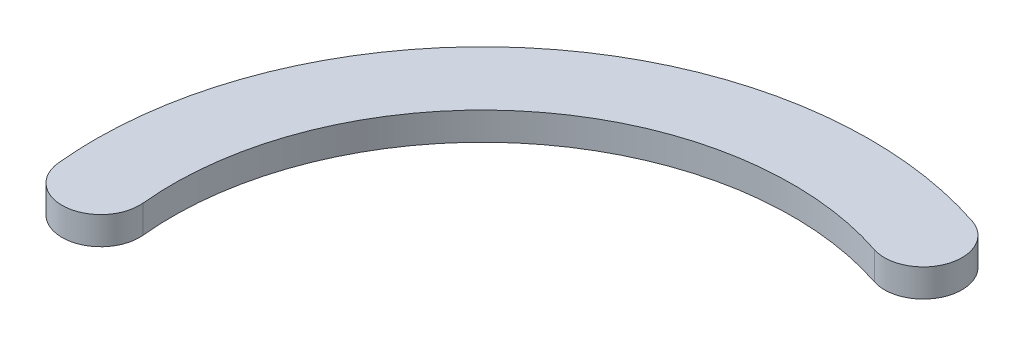
ISO-10303-21;
HEADER;
FILE_DESCRIPTION(('STEP AP214'),'2;1');
FILE_NAME('part.step','',(''),(''),'','','');
FILE_SCHEMA(('AUTOMOTIVE_DESIGN { 1 0 10303 214 1 1 1 1 }'));
ENDSEC;
DATA;
#1=APPLICATION_CONTEXT('core data for automotive mechanical design processes');
#2=APPLICATION_PROTOCOL_DEFINITION('international standard','automotive_design',2000,#1);
#3=PRODUCT_CONTEXT('',#1,'mechanical');
#4=PRODUCT('Part','Part','',(#3));
#5=PRODUCT_RELATED_PRODUCT_CATEGORY('part','',(#4));
#6=PRODUCT_DEFINITION_FORMATION('','',#4);
#7=PRODUCT_DEFINITION_CONTEXT('part definition',#1,'design');
#8=PRODUCT_DEFINITION('design','',#6,#7);
#9=PRODUCT_DEFINITION_SHAPE('','',#8);
#10=(LENGTH_UNIT() NAMED_UNIT(*) SI_UNIT(.MILLI.,.METRE.));
#11=(NAMED_UNIT(*) PLANE_ANGLE_UNIT() SI_UNIT($,.RADIAN.));
#12=(NAMED_UNIT(*) SI_UNIT($,.STERADIAN.) SOLID_ANGLE_UNIT());
#13=UNCERTAINTY_MEASURE_WITH_UNIT(LENGTH_MEASURE(1.E-05),#10,'distance_accuracy_value','');
#14=(GEOMETRIC_REPRESENTATION_CONTEXT(3) GLOBAL_UNCERTAINTY_ASSIGNED_CONTEXT((#13)) GLOBAL_UNIT_ASSIGNED_CONTEXT((#10,
#11,#12)) REPRESENTATION_CONTEXT('',''));
#15=CARTESIAN_POINT('',(0.,0.,0.));
#16=DIRECTION('',(0.,0.,1.));
#17=DIRECTION('',(1.,0.,0.));
#18=AXIS2_PLACEMENT_3D('',#15,#16,#17);
#19=CARTESIAN_POINT('',(47.3717810304759,4.5,-27.7317247769863));
#20=DIRECTION('',(0.,-1.,0.));
#21=DIRECTION('',(0.,0.,-1.));
#22=AXIS2_PLACEMENT_3D('',#19,#20,#21);
#23=CYLINDRICAL_SURFACE('',#22,6.25);
#24=CARTESIAN_POINT('',(47.3717810304759,0.,-27.7317247769863));
#25=DIRECTION('',(0.,1.,0.));
#26=DIRECTION('',(0.,0.,1.));
#27=AXIS2_PLACEMENT_3D('',#24,#25,#26);
#28=CIRCLE('',#27,6.25);
#29=CARTESIAN_POINT('',(45.4062786829082,0.,-21.7988249361238));
#30=VERTEX_POINT('',#29);
#31=CARTESIAN_POINT('',(49.3372833780434,0.,-33.6646246178488));
#32=VERTEX_POINT('',#31);
#33=EDGE_CURVE('E103',#30,#32,#28,.T.);
#34=ORIENTED_EDGE('',*,*,#33,.T.);
#35=DIRECTION('',(0.,-1.,0.));
#36=VECTOR('',#35,1.);
#37=CARTESIAN_POINT('',(49.3372833780434,4.5,-33.6646246178488));
#38=LINE('',#37,#36);
#39=CARTESIAN_POINT('',(49.3372833780434,4.5,-33.6646246178488));
#40=VERTEX_POINT('',#39);
#41=EDGE_CURVE('E11',#40,#32,#38,.T.);
#42=ORIENTED_EDGE('',*,*,#41,.F.);
#43=CARTESIAN_POINT('',(47.3717810304759,4.5,-27.7317247769863));
#44=DIRECTION('',(0.,1.,0.));
#45=DIRECTION('',(0.,0.,1.));
#46=AXIS2_PLACEMENT_3D('',#43,#44,#45);
#47=CIRCLE('',#46,6.25);
#48=CARTESIAN_POINT('',(45.4062786829082,4.5,-21.7988249361238));
#49=VERTEX_POINT('',#48);
#50=EDGE_CURVE('E91',#49,#40,#47,.T.);
#51=ORIENTED_EDGE('',*,*,#50,.F.);
#52=DIRECTION('',(0.,-1.,0.));
#53=VECTOR('',#52,1.);
#54=CARTESIAN_POINT('',(45.4062786829082,4.5,-21.7988249361238));
#55=LINE('',#54,#53);
#56=EDGE_CURVE('E99',#49,#30,#55,.T.);
#57=ORIENTED_EDGE('',*,*,#56,.T.);
#58=EDGE_LOOP('',(#34,#42,#51,#57));
#59=FACE_BOUND('',#58,.T.);
#60=ADVANCED_FACE('F40',(#59),#23,.T.);
#61=CARTESIAN_POINT('',(29.6822599023674,4.5,25.6643737907762));
#62=DIRECTION('',(0.,-1.,0.));
#63=DIRECTION('',(0.,0.,-1.));
#64=AXIS2_PLACEMENT_3D('',#61,#62,#63);
#65=CYLINDRICAL_SURFACE('',#64,62.5);
#66=CARTESIAN_POINT('',(29.6822599023674,0.,25.6643737907762));
#67=DIRECTION('',(0.,1.,0.));
#68=DIRECTION('',(0.,0.,1.));
#69=AXIS2_PLACEMENT_3D('',#66,#67,#68);
#70=CIRCLE('',#69,62.5);
#71=CARTESIAN_POINT('',(-32.5034890473283,0.,31.9239766188648));
#72=VERTEX_POINT('',#71);
#73=EDGE_CURVE('E95',#32,#72,#70,.T.);
#74=ORIENTED_EDGE('',*,*,#73,.T.);
#75=DIRECTION('',(0.,-1.,0.));
#76=VECTOR('',#75,1.);
#77=CARTESIAN_POINT('',(-32.5034890473283,4.5,31.9239766188648));
#78=LINE('',#77,#76);
#79=CARTESIAN_POINT('',(-32.5034890473283,4.5,31.9239766188648));
#80=VERTEX_POINT('',#79);
#81=EDGE_CURVE('E48',#80,#72,#78,.T.);
#82=ORIENTED_EDGE('',*,*,#81,.F.);
#83=CARTESIAN_POINT('',(29.6822599023674,4.5,25.6643737907762));
#84=DIRECTION('',(0.,1.,0.));
#85=DIRECTION('',(0.,0.,1.));
#86=AXIS2_PLACEMENT_3D('',#83,#84,#85);
#87=CIRCLE('',#86,62.5);
#88=EDGE_CURVE('E86',#40,#80,#87,.T.);
#89=ORIENTED_EDGE('',*,*,#88,.F.);
#90=ORIENTED_EDGE('',*,*,#41,.T.);
#91=EDGE_LOOP('',(#74,#82,#89,#90));
#92=FACE_BOUND('',#91,.T.);
#93=ADVANCED_FACE('F94',(#92),#65,.T.);
#94=CARTESIAN_POINT('',(-26.2849141523587,4.5,31.298016336056));
#95=DIRECTION('',(0.,-1.,0.));
#96=DIRECTION('',(0.,0.,-1.));
#97=AXIS2_PLACEMENT_3D('',#94,#95,#96);
#98=CYLINDRICAL_SURFACE('',#97,6.25);
#99=CARTESIAN_POINT('',(-26.2849141523587,0.,31.298016336056));
#100=DIRECTION('',(0.,1.,0.));
#101=DIRECTION('',(0.,0.,1.));
#102=AXIS2_PLACEMENT_3D('',#99,#100,#101);
#103=CIRCLE('',#102,6.25);
#104=CARTESIAN_POINT('',(-20.0663392573892,0.,30.6720560532472));
#105=VERTEX_POINT('',#104);
#106=EDGE_CURVE('E73',#72,#105,#103,.T.);
#107=ORIENTED_EDGE('',*,*,#106,.T.);
#108=DIRECTION('',(0.,-1.,0.));
#109=VECTOR('',#108,1.);
#110=CARTESIAN_POINT('',(-20.0663392573892,4.5,30.6720560532472));
#111=LINE('',#110,#109);
#112=CARTESIAN_POINT('',(-20.0663392573892,4.5,30.6720560532472));
#113=VERTEX_POINT('',#112);
#114=EDGE_CURVE('E96',#113,#105,#111,.T.);
#115=ORIENTED_EDGE('',*,*,#114,.F.);
#116=CARTESIAN_POINT('',(-26.2849141523587,4.5,31.298016336056));
#117=DIRECTION('',(0.,1.,0.));
#118=DIRECTION('',(0.,0.,1.));
#119=AXIS2_PLACEMENT_3D('',#116,#117,#118);
#120=CIRCLE('',#119,6.25);
#121=EDGE_CURVE('E89',#80,#113,#120,.T.);
#122=ORIENTED_EDGE('',*,*,#121,.F.);
#123=ORIENTED_EDGE('',*,*,#81,.T.);
#124=EDGE_LOOP('',(#107,#115,#122,#123));
#125=FACE_BOUND('',#124,.T.);
#126=ADVANCED_FACE('F97',(#125),#98,.T.);
#127=CARTESIAN_POINT('',(29.6822599023674,4.5,25.6643737907762));
#128=DIRECTION('',(0.,-1.,0.));
#129=DIRECTION('',(0.,0.,-1.));
#130=AXIS2_PLACEMENT_3D('',#127,#128,#129);
#131=CYLINDRICAL_SURFACE('',#130,50.);
#132=CARTESIAN_POINT('',(29.6822599023674,0.,25.6643737907762));
#133=DIRECTION('',(0.,-1.,0.));
#134=DIRECTION('',(0.,0.,1.));
#135=AXIS2_PLACEMENT_3D('',#132,#133,#134);
#136=CIRCLE('',#135,50.);
#137=EDGE_CURVE('E79',#105,#30,#136,.T.);
#138=ORIENTED_EDGE('',*,*,#137,.T.);
#139=ORIENTED_EDGE('',*,*,#56,.F.);
#140=CARTESIAN_POINT('',(29.6822599023674,4.5,25.6643737907762));
#141=DIRECTION('',(0.,-1.,0.));
#142=DIRECTION('',(0.,0.,1.));
#143=AXIS2_PLACEMENT_3D('',#140,#141,#142);
#144=CIRCLE('',#143,50.);
#145=EDGE_CURVE('E56',#113,#49,#144,.T.);
#146=ORIENTED_EDGE('',*,*,#145,.F.);
#147=ORIENTED_EDGE('',*,*,#114,.T.);
#148=EDGE_LOOP('',(#138,#139,#146,#147));
#149=FACE_BOUND('',#148,.T.);
#150=ADVANCED_FACE('F110',(#149),#131,.F.);
#151=CARTESIAN_POINT('',(38.5270204664216,4.5,-1.03367549310504));
#152=DIRECTION('',(0.,1.,0.));
#153=DIRECTION('',(0.,0.,1.));
#154=AXIS2_PLACEMENT_3D('',#151,#152,#153);
#155=PLANE('',#154);
#156=ORIENTED_EDGE('',*,*,#50,.T.);
#157=ORIENTED_EDGE('',*,*,#88,.T.);
#158=ORIENTED_EDGE('',*,*,#121,.T.);
#159=ORIENTED_EDGE('',*,*,#145,.T.);
#160=EDGE_LOOP('',(#156,#157,#158,#159));
#161=FACE_BOUND('',#160,.T.);
#162=ADVANCED_FACE('F87',(#161),#155,.T.);
#163=CARTESIAN_POINT('',(38.5270204664216,0.,-1.03367549310504));
#164=DIRECTION('',(0.,1.,0.));
#165=DIRECTION('',(0.,0.,1.));
#166=AXIS2_PLACEMENT_3D('',#163,#164,#165);
#167=PLANE('',#166);
#168=ORIENTED_EDGE('',*,*,#33,.F.);
#169=ORIENTED_EDGE('',*,*,#137,.F.);
#170=ORIENTED_EDGE('',*,*,#106,.F.);
#171=ORIENTED_EDGE('',*,*,#73,.F.);
#172=EDGE_LOOP('',(#168,#169,#170,#171));
#173=FACE_BOUND('',#172,.T.);
#174=ADVANCED_FACE('F113',(#173),#167,.F.);
#175=CLOSED_SHELL('',(#60,#93,#126,#150,#162,#174));
#176=MANIFOLD_SOLID_BREP('B2',#175);
#177=ADVANCED_BREP_SHAPE_REPRESENTATION('',(#18,#176),#14);
#178=SHAPE_DEFINITION_REPRESENTATION(#9,#177);
ENDSEC;
END-ISO-10303-21;
